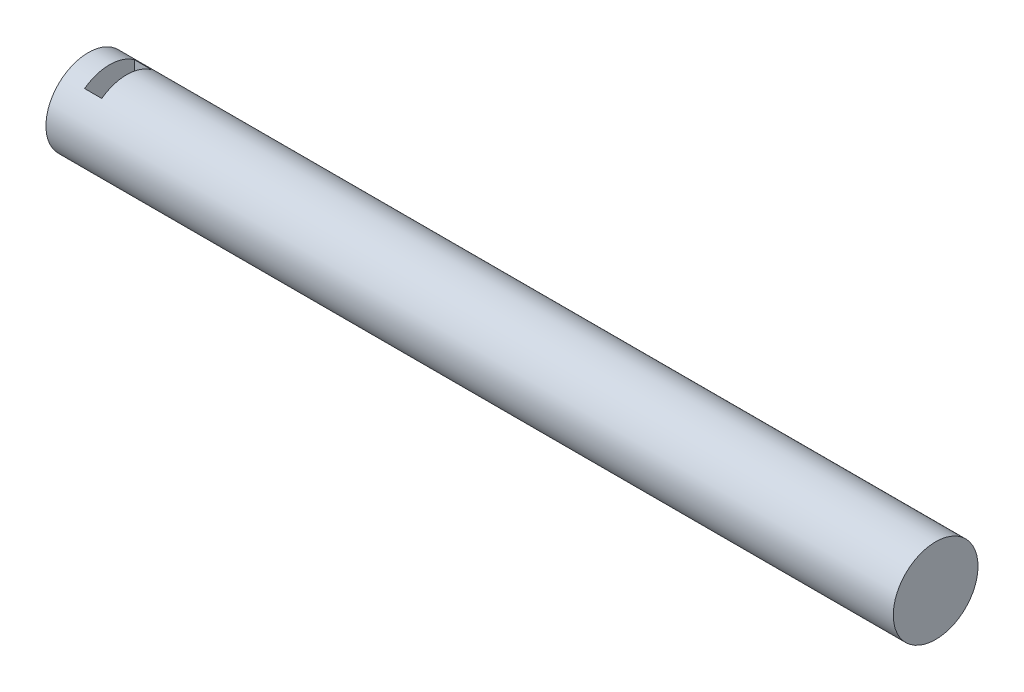
ISO-10303-21;
HEADER;
FILE_DESCRIPTION(('STEP AP214'),'2;1');
FILE_NAME('part.step','',(''),(''),'','','');
FILE_SCHEMA(('AUTOMOTIVE_DESIGN { 1 0 10303 214 1 1 1 1 }'));
ENDSEC;
DATA;
#1=APPLICATION_CONTEXT('core data for automotive mechanical design processes');
#2=APPLICATION_PROTOCOL_DEFINITION('international standard','automotive_design',2000,#1);
#3=PRODUCT_CONTEXT('',#1,'mechanical');
#4=PRODUCT('Part','Part','',(#3));
#5=PRODUCT_RELATED_PRODUCT_CATEGORY('part','',(#4));
#6=PRODUCT_DEFINITION_FORMATION('','',#4);
#7=PRODUCT_DEFINITION_CONTEXT('part definition',#1,'design');
#8=PRODUCT_DEFINITION('design','',#6,#7);
#9=PRODUCT_DEFINITION_SHAPE('','',#8);
#10=(LENGTH_UNIT() NAMED_UNIT(*) SI_UNIT(.MILLI.,.METRE.));
#11=(NAMED_UNIT(*) PLANE_ANGLE_UNIT() SI_UNIT($,.RADIAN.));
#12=(NAMED_UNIT(*) SI_UNIT($,.STERADIAN.) SOLID_ANGLE_UNIT());
#13=UNCERTAINTY_MEASURE_WITH_UNIT(LENGTH_MEASURE(1.E-05),#10,'distance_accuracy_value','');
#14=(GEOMETRIC_REPRESENTATION_CONTEXT(3) GLOBAL_UNCERTAINTY_ASSIGNED_CONTEXT((#13)) GLOBAL_UNIT_ASSIGNED_CONTEXT((#10,
#11,#12)) REPRESENTATION_CONTEXT('',''));
#15=CARTESIAN_POINT('',(0.,0.,0.));
#16=DIRECTION('',(0.,0.,1.));
#17=DIRECTION('',(1.,0.,0.));
#18=AXIS2_PLACEMENT_3D('',#15,#16,#17);
#19=CARTESIAN_POINT('',(9.99999999999999,-3.99999999999989,-11.7541270931754));
#20=DIRECTION('',(-1.,0.,0.));
#21=DIRECTION('',(0.,0.,1.));
#22=AXIS2_PLACEMENT_3D('',#19,#20,#21);
#23=PLANE('',#22);
#24=DIRECTION('',(0.,1.,0.));
#25=VECTOR('',#24,1.);
#26=CARTESIAN_POINT('',(9.99999999999999,-3.99999999999989,-11.555310972537));
#27=LINE('',#26,#25);
#28=CARTESIAN_POINT('',(9.99999999999999,-3.99999999999989,-11.555310972537));
#29=VERTEX_POINT('',#28);
#30=CARTESIAN_POINT('',(9.99999999999999,3.35051254226592,-11.555310972537));
#31=VERTEX_POINT('',#30);
#32=EDGE_CURVE('E188',#29,#31,#27,.T.);
#33=ORIENTED_EDGE('',*,*,#32,.F.);
#34=DIRECTION('',(0.,0.,1.));
#35=VECTOR('',#34,1.);
#36=CARTESIAN_POINT('',(9.99999999999999,-3.99999999999989,-11.7541270931754));
#37=LINE('',#36,#35);
#38=CARTESIAN_POINT('',(9.99999999999999,-3.99999999999989,-11.7541270931754));
#39=VERTEX_POINT('',#38);
#40=EDGE_CURVE('E227',#39,#29,#37,.T.);
#41=ORIENTED_EDGE('',*,*,#40,.F.);
#42=DIRECTION('',(0.,1.,0.));
#43=VECTOR('',#42,1.);
#44=CARTESIAN_POINT('',(9.99999999999999,-3.99999999999989,-11.7541270931754));
#45=LINE('',#44,#43);
#46=CARTESIAN_POINT('',(10.,16.1814862196734,-11.7541270931754));
#47=VERTEX_POINT('',#46);
#48=EDGE_CURVE('E61',#39,#47,#45,.T.);
#49=ORIENTED_EDGE('',*,*,#48,.T.);
#50=CARTESIAN_POINT('',(10.,0.,0.));
#51=DIRECTION('',(-1.,0.,0.));
#52=DIRECTION('',(0.,0.,1.));
#53=AXIS2_PLACEMENT_3D('',#50,#51,#52);
#54=CIRCLE('',#53,20.);
#55=CARTESIAN_POINT('',(10.,16.1685269175661,11.7719470486381));
#56=VERTEX_POINT('',#55);
#57=EDGE_CURVE('E257',#56,#47,#54,.T.);
#58=ORIENTED_EDGE('',*,*,#57,.F.);
#59=DIRECTION('',(0.,1.,0.));
#60=VECTOR('',#59,1.);
#61=CARTESIAN_POINT('',(9.99999999999999,-3.99999999999989,11.7719470486381));
#62=LINE('',#61,#60);
#63=CARTESIAN_POINT('',(9.99999999999999,-3.99999999999989,11.7719470486381));
#64=VERTEX_POINT('',#63);
#65=EDGE_CURVE('E247',#64,#56,#62,.T.);
#66=ORIENTED_EDGE('',*,*,#65,.F.);
#67=CARTESIAN_POINT('',(9.99999999999999,-3.99999999999989,10.2362115464483));
#68=VERTEX_POINT('',#67);
#69=EDGE_CURVE('E226',#68,#64,#37,.T.);
#70=ORIENTED_EDGE('',*,*,#69,.F.);
#71=DIRECTION('',(0.,-1.,0.));
#72=VECTOR('',#71,1.);
#73=CARTESIAN_POINT('',(9.99999999999999,-3.99999999999989,10.2362115464483));
#74=LINE('',#73,#72);
#75=CARTESIAN_POINT('',(9.99999999999999,3.35051254226592,10.2362115464483));
#76=VERTEX_POINT('',#75);
#77=EDGE_CURVE('E182',#76,#68,#74,.T.);
#78=ORIENTED_EDGE('',*,*,#77,.F.);
#79=DIRECTION('',(0.,0.,1.));
#80=VECTOR('',#79,1.);
#81=CARTESIAN_POINT('',(9.99999999999999,3.35051254226592,-11.7541270931754));
#82=LINE('',#81,#80);
#83=EDGE_CURVE('E11',#31,#76,#82,.T.);
#84=ORIENTED_EDGE('',*,*,#83,.F.);
#85=EDGE_LOOP('',(#33,#41,#49,#58,#66,#70,#78,#84));
#86=FACE_BOUND('',#85,.T.);
#87=ADVANCED_FACE('F45',(#86),#23,.F.);
#88=CARTESIAN_POINT('',(0.,-3.99999999999989,0.));
#89=DIRECTION('',(0.,1.,0.));
#90=DIRECTION('',(0.,0.,1.));
#91=AXIS2_PLACEMENT_3D('',#88,#89,#90);
#92=PLANE('',#91);
#93=ORIENTED_EDGE('',*,*,#40,.T.);
#94=DIRECTION('',(1.,0.,0.));
#95=VECTOR('',#94,1.);
#96=CARTESIAN_POINT('',(0.,-3.99999999999989,-11.555310972537));
#97=LINE('',#96,#95);
#98=CARTESIAN_POINT('',(18.1241119338636,-3.99999999999989,-11.555310972537));
#99=VERTEX_POINT('',#98);
#100=EDGE_CURVE('E185',#29,#99,#97,.T.);
#101=ORIENTED_EDGE('',*,*,#100,.T.);
#102=DIRECTION('',(0.,0.,-1.));
#103=VECTOR('',#102,1.);
#104=CARTESIAN_POINT('',(18.1241119338636,-3.99999999999989,11.7719470486381));
#105=LINE('',#104,#103);
#106=CARTESIAN_POINT('',(18.1241119338636,-3.99999999999989,-11.7541270931754));
#107=VERTEX_POINT('',#106);
#108=EDGE_CURVE('E235',#99,#107,#105,.T.);
#109=ORIENTED_EDGE('',*,*,#108,.T.);
#110=DIRECTION('',(-1.,0.,0.));
#111=VECTOR('',#110,1.);
#112=CARTESIAN_POINT('',(18.1241119338636,-3.99999999999989,-11.7541270931754));
#113=LINE('',#112,#111);
#114=EDGE_CURVE('E216',#107,#39,#113,.T.);
#115=ORIENTED_EDGE('',*,*,#114,.T.);
#116=EDGE_LOOP('',(#93,#101,#109,#115));
#117=FACE_BOUND('',#116,.T.);
#118=ADVANCED_FACE('F290',(#117),#92,.T.);
#119=CARTESIAN_POINT('',(18.1241119338636,-3.99999999999989,11.7719470486381));
#120=VERTEX_POINT('',#119);
#121=CARTESIAN_POINT('',(18.1241119338636,-3.99999999999989,10.2362115464483));
#122=VERTEX_POINT('',#121);
#123=EDGE_CURVE('E236',#120,#122,#105,.T.);
#124=ORIENTED_EDGE('',*,*,#123,.T.);
#125=DIRECTION('',(-1.,0.,0.));
#126=VECTOR('',#125,1.);
#127=CARTESIAN_POINT('',(0.,-3.99999999999989,10.2362115464483));
#128=LINE('',#127,#126);
#129=EDGE_CURVE('E178',#122,#68,#128,.T.);
#130=ORIENTED_EDGE('',*,*,#129,.T.);
#131=ORIENTED_EDGE('',*,*,#69,.T.);
#132=DIRECTION('',(1.,0.,0.));
#133=VECTOR('',#132,1.);
#134=CARTESIAN_POINT('',(9.99999999999999,-3.99999999999989,11.7719470486381));
#135=LINE('',#134,#133);
#136=EDGE_CURVE('E231',#64,#120,#135,.T.);
#137=ORIENTED_EDGE('',*,*,#136,.T.);
#138=EDGE_LOOP('',(#124,#130,#131,#137));
#139=FACE_BOUND('',#138,.T.);
#140=ADVANCED_FACE('F283',(#139),#92,.T.);
#141=CARTESIAN_POINT('',(400.,0.,0.));
#142=DIRECTION('',(-1.,0.,0.));
#143=DIRECTION('',(0.,0.,1.));
#144=AXIS2_PLACEMENT_3D('',#141,#142,#143);
#145=CYLINDRICAL_SURFACE('',#144,20.);
#146=DIRECTION('',(-1.,0.,0.));
#147=VECTOR('',#146,1.);
#148=CARTESIAN_POINT('',(400.,16.1685269175661,11.7719470486381));
#149=LINE('',#148,#147);
#150=CARTESIAN_POINT('',(18.1241119338636,16.1685269175661,11.7719470486381));
#151=VERTEX_POINT('',#150);
#152=EDGE_CURVE('E54',#151,#56,#149,.T.);
#153=ORIENTED_EDGE('',*,*,#152,.T.);
#154=ORIENTED_EDGE('',*,*,#57,.T.);
#155=DIRECTION('',(-1.,0.,0.));
#156=VECTOR('',#155,1.);
#157=CARTESIAN_POINT('',(400.,16.1814862196733,-11.7541270931754));
#158=LINE('',#157,#156);
#159=CARTESIAN_POINT('',(18.1241119338637,16.1814862196734,-11.7541270931754));
#160=VERTEX_POINT('',#159);
#161=EDGE_CURVE('E266',#47,#160,#158,.F.);
#162=ORIENTED_EDGE('',*,*,#161,.T.);
#163=CARTESIAN_POINT('',(18.1241119338637,0.,0.));
#164=DIRECTION('',(1.,0.,0.));
#165=DIRECTION('',(0.,0.,-1.));
#166=AXIS2_PLACEMENT_3D('',#163,#164,#165);
#167=CIRCLE('',#166,20.);
#168=EDGE_CURVE('E69',#160,#151,#167,.T.);
#169=ORIENTED_EDGE('',*,*,#168,.T.);
#170=EDGE_LOOP('',(#153,#154,#162,#169));
#171=FACE_BOUND('',#170,.T.);
#172=CARTESIAN_POINT('',(400.,0.,0.));
#173=DIRECTION('',(1.,0.,0.));
#174=DIRECTION('',(0.,0.,-1.));
#175=AXIS2_PLACEMENT_3D('',#172,#173,#174);
#176=CIRCLE('',#175,20.);
#177=CARTESIAN_POINT('',(400.,0.,-20.));
#178=VERTEX_POINT('',#177);
#179=EDGE_CURVE('E253',#178,#178,#176,.T.);
#180=ORIENTED_EDGE('',*,*,#179,.F.);
#181=EDGE_LOOP('',(#180));
#182=FACE_BOUND('',#181,.T.);
#183=CARTESIAN_POINT('',(0.,0.,0.));
#184=DIRECTION('',(1.,0.,0.));
#185=DIRECTION('',(0.,0.,-1.));
#186=AXIS2_PLACEMENT_3D('',#183,#184,#185);
#187=CIRCLE('',#186,20.);
#188=CARTESIAN_POINT('',(0.,0.,-20.));
#189=VERTEX_POINT('',#188);
#190=EDGE_CURVE('E243',#189,#189,#187,.T.);
#191=ORIENTED_EDGE('',*,*,#190,.T.);
#192=EDGE_LOOP('',(#191));
#193=FACE_BOUND('',#192,.T.);
#194=ADVANCED_FACE('F47',(#171,#182,#193),#145,.T.);
#195=CARTESIAN_POINT('',(400.,0.,0.));
#196=DIRECTION('',(1.,0.,0.));
#197=DIRECTION('',(0.,0.,-1.));
#198=AXIS2_PLACEMENT_3D('',#195,#196,#197);
#199=PLANE('',#198);
#200=ORIENTED_EDGE('',*,*,#179,.T.);
#201=EDGE_LOOP('',(#200));
#202=FACE_BOUND('',#201,.T.);
#203=ADVANCED_FACE('F306',(#202),#199,.T.);
#204=CARTESIAN_POINT('',(0.,0.,0.));
#205=DIRECTION('',(1.,0.,0.));
#206=DIRECTION('',(0.,0.,-1.));
#207=AXIS2_PLACEMENT_3D('',#204,#205,#206);
#208=PLANE('',#207);
#209=ORIENTED_EDGE('',*,*,#190,.F.);
#210=EDGE_LOOP('',(#209));
#211=FACE_BOUND('',#210,.T.);
#212=ADVANCED_FACE('F304',(#211),#208,.F.);
#213=CARTESIAN_POINT('',(18.1241119338636,-3.99999999999989,-11.7541270931754));
#214=DIRECTION('',(0.,0.,-1.));
#215=DIRECTION('',(-1.,0.,0.));
#216=AXIS2_PLACEMENT_3D('',#213,#214,#215);
#217=PLANE('',#216);
#218=ORIENTED_EDGE('',*,*,#48,.F.);
#219=ORIENTED_EDGE('',*,*,#114,.F.);
#220=DIRECTION('',(0.,1.,0.));
#221=VECTOR('',#220,1.);
#222=CARTESIAN_POINT('',(18.1241119338636,-3.99999999999989,-11.7541270931754));
#223=LINE('',#222,#221);
#224=EDGE_CURVE('E240',#107,#160,#223,.T.);
#225=ORIENTED_EDGE('',*,*,#224,.T.);
#226=ORIENTED_EDGE('',*,*,#161,.F.);
#227=EDGE_LOOP('',(#218,#219,#225,#226));
#228=FACE_BOUND('',#227,.T.);
#229=ADVANCED_FACE('F301',(#228),#217,.F.);
#230=CARTESIAN_POINT('',(18.1241119338636,-3.99999999999989,11.7719470486381));
#231=DIRECTION('',(1.,0.,0.));
#232=DIRECTION('',(0.,0.,-1.));
#233=AXIS2_PLACEMENT_3D('',#230,#231,#232);
#234=PLANE('',#233);
#235=ORIENTED_EDGE('',*,*,#108,.F.);
#236=DIRECTION('',(0.,-1.,0.));
#237=VECTOR('',#236,1.);
#238=CARTESIAN_POINT('',(18.1241119338636,3.35051254226592,-11.555310972537));
#239=LINE('',#238,#237);
#240=CARTESIAN_POINT('',(18.1241119338636,3.35051254226592,-11.555310972537));
#241=VERTEX_POINT('',#240);
#242=EDGE_CURVE('E191',#241,#99,#239,.T.);
#243=ORIENTED_EDGE('',*,*,#242,.F.);
#244=DIRECTION('',(0.,0.,-1.));
#245=VECTOR('',#244,1.);
#246=CARTESIAN_POINT('',(18.1241119338636,3.35051254226592,10.2362115464483));
#247=LINE('',#246,#245);
#248=CARTESIAN_POINT('',(18.1241119338636,3.35051254226592,10.2362115464483));
#249=VERTEX_POINT('',#248);
#250=EDGE_CURVE('E195',#249,#241,#247,.T.);
#251=ORIENTED_EDGE('',*,*,#250,.F.);
#252=DIRECTION('',(0.,1.,0.));
#253=VECTOR('',#252,1.);
#254=CARTESIAN_POINT('',(18.1241119338636,-4.03644424383076,10.2362115464483));
#255=LINE('',#254,#253);
#256=EDGE_CURVE('E207',#122,#249,#255,.T.);
#257=ORIENTED_EDGE('',*,*,#256,.F.);
#258=ORIENTED_EDGE('',*,*,#123,.F.);
#259=DIRECTION('',(0.,1.,0.));
#260=VECTOR('',#259,1.);
#261=CARTESIAN_POINT('',(18.1241119338636,-3.99999999999989,11.7719470486381));
#262=LINE('',#261,#260);
#263=EDGE_CURVE('E244',#120,#151,#262,.T.);
#264=ORIENTED_EDGE('',*,*,#263,.T.);
#265=ORIENTED_EDGE('',*,*,#168,.F.);
#266=ORIENTED_EDGE('',*,*,#224,.F.);
#267=EDGE_LOOP('',(#235,#243,#251,#257,#258,#264,#265,#266));
#268=FACE_BOUND('',#267,.T.);
#269=ADVANCED_FACE('F279',(#268),#234,.F.);
#270=CARTESIAN_POINT('',(9.99999999999999,-3.99999999999989,11.7719470486381));
#271=DIRECTION('',(0.,0.,1.));
#272=DIRECTION('',(1.,0.,0.));
#273=AXIS2_PLACEMENT_3D('',#270,#271,#272);
#274=PLANE('',#273);
#275=ORIENTED_EDGE('',*,*,#263,.F.);
#276=ORIENTED_EDGE('',*,*,#136,.F.);
#277=ORIENTED_EDGE('',*,*,#65,.T.);
#278=ORIENTED_EDGE('',*,*,#152,.F.);
#279=EDGE_LOOP('',(#275,#276,#277,#278));
#280=FACE_BOUND('',#279,.T.);
#281=ADVANCED_FACE('F274',(#280),#274,.F.);
#282=CARTESIAN_POINT('',(35.1241119338635,3.35051254226592,-11.555310972537));
#283=DIRECTION('',(0.,0.,-1.));
#284=DIRECTION('',(-1.,0.,0.));
#285=AXIS2_PLACEMENT_3D('',#282,#283,#284);
#286=PLANE('',#285);
#287=ORIENTED_EDGE('',*,*,#242,.T.);
#288=ORIENTED_EDGE('',*,*,#100,.F.);
#289=ORIENTED_EDGE('',*,*,#32,.T.);
#290=DIRECTION('',(1.,0.,0.));
#291=VECTOR('',#290,1.);
#292=CARTESIAN_POINT('',(7.12411193386377,3.35051254226592,-11.555310972537));
#293=LINE('',#292,#291);
#294=CARTESIAN_POINT('',(7.12411193386377,3.35051254226592,-11.555310972537));
#295=VERTEX_POINT('',#294);
#296=EDGE_CURVE('E163',#295,#31,#293,.T.);
#297=ORIENTED_EDGE('',*,*,#296,.F.);
#298=DIRECTION('',(0.,-1.,0.));
#299=VECTOR('',#298,1.);
#300=CARTESIAN_POINT('',(7.12411193386377,3.35051254226592,-11.555310972537));
#301=LINE('',#300,#299);
#302=CARTESIAN_POINT('',(7.12411193386377,-4.03644424383076,-11.555310972537));
#303=VERTEX_POINT('',#302);
#304=EDGE_CURVE('E155',#295,#303,#301,.T.);
#305=ORIENTED_EDGE('',*,*,#304,.T.);
#306=DIRECTION('',(-1.,0.,0.));
#307=VECTOR('',#306,1.);
#308=CARTESIAN_POINT('',(35.1241119338635,-4.03644424383076,-11.555310972537));
#309=LINE('',#308,#307);
#310=CARTESIAN_POINT('',(35.1241119338635,-4.03644424383076,-11.555310972537));
#311=VERTEX_POINT('',#310);
#312=EDGE_CURVE('E136',#311,#303,#309,.T.);
#313=ORIENTED_EDGE('',*,*,#312,.F.);
#314=DIRECTION('',(0.,-1.,0.));
#315=VECTOR('',#314,1.);
#316=CARTESIAN_POINT('',(35.1241119338635,3.35051254226592,-11.555310972537));
#317=LINE('',#316,#315);
#318=CARTESIAN_POINT('',(35.1241119338635,3.35051254226592,-11.555310972537));
#319=VERTEX_POINT('',#318);
#320=EDGE_CURVE('E192',#319,#311,#317,.T.);
#321=ORIENTED_EDGE('',*,*,#320,.F.);
#322=DIRECTION('',(-1.,0.,0.));
#323=VECTOR('',#322,1.);
#324=CARTESIAN_POINT('',(35.1241119338635,3.35051254226592,-11.555310972537));
#325=LINE('',#324,#323);
#326=EDGE_CURVE('E213',#319,#241,#325,.T.);
#327=ORIENTED_EDGE('',*,*,#326,.T.);
#328=EDGE_LOOP('',(#287,#288,#289,#297,#305,#313,#321,#327));
#329=FACE_BOUND('',#328,.T.);
#330=ADVANCED_FACE('F161',(#329),#286,.F.);
#331=CARTESIAN_POINT('',(35.1241119338635,3.35051254226592,10.2362115464483));
#332=DIRECTION('',(0.,1.,0.));
#333=DIRECTION('',(0.,0.,1.));
#334=AXIS2_PLACEMENT_3D('',#331,#332,#333);
#335=PLANE('',#334);
#336=ORIENTED_EDGE('',*,*,#250,.T.);
#337=ORIENTED_EDGE('',*,*,#326,.F.);
#338=DIRECTION('',(0.,0.,-1.));
#339=VECTOR('',#338,1.);
#340=CARTESIAN_POINT('',(35.1241119338635,3.35051254226592,10.2362115464483));
#341=LINE('',#340,#339);
#342=CARTESIAN_POINT('',(35.1241119338635,3.35051254226592,10.2362115464483));
#343=VERTEX_POINT('',#342);
#344=EDGE_CURVE('E149',#343,#319,#341,.T.);
#345=ORIENTED_EDGE('',*,*,#344,.F.);
#346=DIRECTION('',(-1.,0.,0.));
#347=VECTOR('',#346,1.);
#348=CARTESIAN_POINT('',(35.1241119338635,3.35051254226592,10.2362115464483));
#349=LINE('',#348,#347);
#350=EDGE_CURVE('E217',#343,#249,#349,.T.);
#351=ORIENTED_EDGE('',*,*,#350,.T.);
#352=EDGE_LOOP('',(#336,#337,#345,#351));
#353=FACE_BOUND('',#352,.T.);
#354=ADVANCED_FACE('F331',(#353),#335,.F.);
#355=CARTESIAN_POINT('',(35.1241119338635,-4.03644424383076,10.2362115464483));
#356=DIRECTION('',(0.,0.,1.));
#357=DIRECTION('',(1.,0.,0.));
#358=AXIS2_PLACEMENT_3D('',#355,#356,#357);
#359=PLANE('',#358);
#360=DIRECTION('',(-1.,0.,0.));
#361=VECTOR('',#360,1.);
#362=CARTESIAN_POINT('',(35.1241119338635,-4.03644424383076,10.2362115464483));
#363=LINE('',#362,#361);
#364=CARTESIAN_POINT('',(35.1241119338635,-4.03644424383076,10.2362115464483));
#365=VERTEX_POINT('',#364);
#366=CARTESIAN_POINT('',(7.12411193386377,-4.03644424383076,10.2362115464483));
#367=VERTEX_POINT('',#366);
#368=EDGE_CURVE('E148',#365,#367,#363,.T.);
#369=ORIENTED_EDGE('',*,*,#368,.T.);
#370=DIRECTION('',(0.,1.,0.));
#371=VECTOR('',#370,1.);
#372=CARTESIAN_POINT('',(7.12411193386377,-4.03644424383076,10.2362115464483));
#373=LINE('',#372,#371);
#374=CARTESIAN_POINT('',(7.12411193386377,3.35051254226592,10.2362115464483));
#375=VERTEX_POINT('',#374);
#376=EDGE_CURVE('E156',#367,#375,#373,.T.);
#377=ORIENTED_EDGE('',*,*,#376,.T.);
#378=DIRECTION('',(1.,0.,0.));
#379=VECTOR('',#378,1.);
#380=CARTESIAN_POINT('',(7.12411193386377,3.35051254226592,10.2362115464483));
#381=LINE('',#380,#379);
#382=EDGE_CURVE('E174',#375,#76,#381,.T.);
#383=ORIENTED_EDGE('',*,*,#382,.T.);
#384=ORIENTED_EDGE('',*,*,#77,.T.);
#385=ORIENTED_EDGE('',*,*,#129,.F.);
#386=ORIENTED_EDGE('',*,*,#256,.T.);
#387=ORIENTED_EDGE('',*,*,#350,.F.);
#388=DIRECTION('',(0.,1.,0.));
#389=VECTOR('',#388,1.);
#390=CARTESIAN_POINT('',(35.1241119338635,-4.03644424383076,10.2362115464483));
#391=LINE('',#390,#389);
#392=EDGE_CURVE('E198',#365,#343,#391,.T.);
#393=ORIENTED_EDGE('',*,*,#392,.F.);
#394=EDGE_LOOP('',(#369,#377,#383,#384,#385,#386,#387,#393));
#395=FACE_BOUND('',#394,.T.);
#396=ADVANCED_FACE('F335',(#395),#359,.F.);
#397=CARTESIAN_POINT('',(35.1241119338635,-4.03644424383076,-11.555310972537));
#398=DIRECTION('',(0.,-1.,0.));
#399=DIRECTION('',(0.,0.,-1.));
#400=AXIS2_PLACEMENT_3D('',#397,#398,#399);
#401=PLANE('',#400);
#402=ORIENTED_EDGE('',*,*,#312,.T.);
#403=DIRECTION('',(0.,0.,1.));
#404=VECTOR('',#403,1.);
#405=CARTESIAN_POINT('',(7.12411193386377,-4.03644424383076,-11.555310972537));
#406=LINE('',#405,#404);
#407=EDGE_CURVE('E139',#303,#367,#406,.T.);
#408=ORIENTED_EDGE('',*,*,#407,.T.);
#409=ORIENTED_EDGE('',*,*,#368,.F.);
#410=DIRECTION('',(0.,0.,1.));
#411=VECTOR('',#410,1.);
#412=CARTESIAN_POINT('',(35.1241119338635,-4.03644424383076,-11.555310972537));
#413=LINE('',#412,#411);
#414=EDGE_CURVE('E142',#311,#365,#413,.T.);
#415=ORIENTED_EDGE('',*,*,#414,.F.);
#416=EDGE_LOOP('',(#402,#408,#409,#415));
#417=FACE_BOUND('',#416,.T.);
#418=ADVANCED_FACE('F138',(#417),#401,.F.);
#419=CARTESIAN_POINT('',(35.1241119338635,0.,0.));
#420=DIRECTION('',(-1.,0.,0.));
#421=DIRECTION('',(0.,0.,1.));
#422=AXIS2_PLACEMENT_3D('',#419,#420,#421);
#423=PLANE('',#422);
#424=ORIENTED_EDGE('',*,*,#320,.T.);
#425=ORIENTED_EDGE('',*,*,#414,.T.);
#426=ORIENTED_EDGE('',*,*,#392,.T.);
#427=ORIENTED_EDGE('',*,*,#344,.T.);
#428=EDGE_LOOP('',(#424,#425,#426,#427));
#429=FACE_BOUND('',#428,.T.);
#430=ADVANCED_FACE('F343',(#429),#423,.T.);
#431=CARTESIAN_POINT('',(7.12411193386377,3.35051254226592,10.2362115464483));
#432=DIRECTION('',(0.,-1.,0.));
#433=DIRECTION('',(0.,0.,-1.));
#434=AXIS2_PLACEMENT_3D('',#431,#432,#433);
#435=PLANE('',#434);
#436=ORIENTED_EDGE('',*,*,#83,.T.);
#437=ORIENTED_EDGE('',*,*,#382,.F.);
#438=DIRECTION('',(0.,0.,-1.));
#439=VECTOR('',#438,1.);
#440=CARTESIAN_POINT('',(7.12411193386377,3.35051254226592,10.2362115464483));
#441=LINE('',#440,#439);
#442=EDGE_CURVE('E169',#375,#295,#441,.T.);
#443=ORIENTED_EDGE('',*,*,#442,.T.);
#444=ORIENTED_EDGE('',*,*,#296,.T.);
#445=EDGE_LOOP('',(#436,#437,#443,#444));
#446=FACE_BOUND('',#445,.T.);
#447=ADVANCED_FACE('F349',(#446),#435,.T.);
#448=CARTESIAN_POINT('',(7.12411193386377,0.,0.));
#449=DIRECTION('',(-1.,0.,0.));
#450=DIRECTION('',(0.,0.,1.));
#451=AXIS2_PLACEMENT_3D('',#448,#449,#450);
#452=PLANE('',#451);
#453=ORIENTED_EDGE('',*,*,#304,.F.);
#454=ORIENTED_EDGE('',*,*,#442,.F.);
#455=ORIENTED_EDGE('',*,*,#376,.F.);
#456=ORIENTED_EDGE('',*,*,#407,.F.);
#457=EDGE_LOOP('',(#453,#454,#455,#456));
#458=FACE_BOUND('',#457,.T.);
#459=ADVANCED_FACE('F153',(#458),#452,.F.);
#460=CLOSED_SHELL('',(#87,#118,#140,#194,#203,#212,#229,#269,#281,#330,#354,#396,#418,#430,#447,#459));
#461=MANIFOLD_SOLID_BREP('B2',#460);
#462=ADVANCED_BREP_SHAPE_REPRESENTATION('',(#18,#461),#14);
#463=SHAPE_DEFINITION_REPRESENTATION(#9,#462);
ENDSEC;
END-ISO-10303-21;
